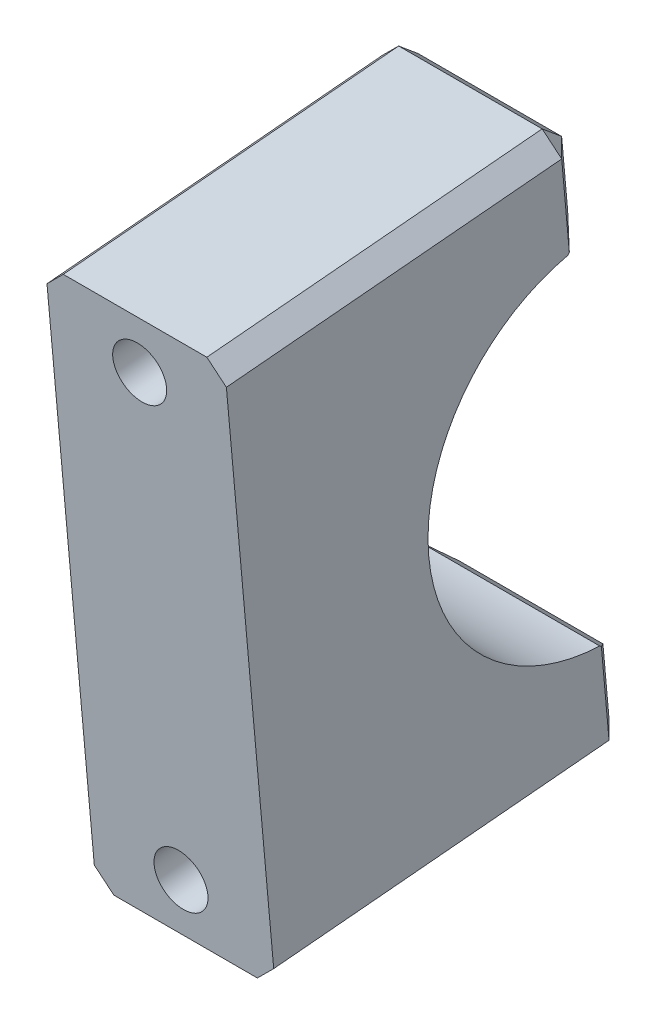
ISO-10303-21;
HEADER;
FILE_DESCRIPTION(('STEP AP214'),'2;1');
FILE_NAME('part.step','',(''),(''),'','','');
FILE_SCHEMA(('AUTOMOTIVE_DESIGN { 1 0 10303 214 1 1 1 1 }'));
ENDSEC;
DATA;
#1=APPLICATION_CONTEXT('core data for automotive mechanical design processes');
#2=APPLICATION_PROTOCOL_DEFINITION('international standard','automotive_design',2000,#1);
#3=PRODUCT_CONTEXT('',#1,'mechanical');
#4=PRODUCT('Part','Part','',(#3));
#5=PRODUCT_RELATED_PRODUCT_CATEGORY('part','',(#4));
#6=PRODUCT_DEFINITION_FORMATION('','',#4);
#7=PRODUCT_DEFINITION_CONTEXT('part definition',#1,'design');
#8=PRODUCT_DEFINITION('design','',#6,#7);
#9=PRODUCT_DEFINITION_SHAPE('','',#8);
#10=(LENGTH_UNIT() NAMED_UNIT(*) SI_UNIT(.MILLI.,.METRE.));
#11=(NAMED_UNIT(*) PLANE_ANGLE_UNIT() SI_UNIT($,.RADIAN.));
#12=(NAMED_UNIT(*) SI_UNIT($,.STERADIAN.) SOLID_ANGLE_UNIT());
#13=UNCERTAINTY_MEASURE_WITH_UNIT(LENGTH_MEASURE(1.E-05),#10,'distance_accuracy_value','');
#14=(GEOMETRIC_REPRESENTATION_CONTEXT(3) GLOBAL_UNCERTAINTY_ASSIGNED_CONTEXT((#13)) GLOBAL_UNIT_ASSIGNED_CONTEXT((#10,
#11,#12)) REPRESENTATION_CONTEXT('',''));
#15=CARTESIAN_POINT('',(0.,0.,0.));
#16=DIRECTION('',(0.,0.,1.));
#17=DIRECTION('',(1.,0.,0.));
#18=AXIS2_PLACEMENT_3D('',#15,#16,#17);
#19=CARTESIAN_POINT('',(0.,12.6267527219774,-140.67598203209));
#20=DIRECTION('',(0.,0.0893983070615616,-0.995995955159722));
#21=DIRECTION('',(0.,0.995995955159722,0.0893983070615616));
#22=AXIS2_PLACEMENT_3D('',#19,#20,#21);
#23=PLANE('',#22);
#24=DIRECTION('',(0.,-0.995995955159722,-0.0893983070615616));
#25=VECTOR('',#24,1.);
#26=CARTESIAN_POINT('',(-143.608320490601,136.633762355327,-129.545397949336));
#27=LINE('',#26,#25);
#28=CARTESIAN_POINT('',(-143.608320490601,141.367496523087,-129.120508853668));
#29=VERTEX_POINT('',#28);
#30=CARTESIAN_POINT('',(-143.608320490601,137.629758310487,-129.455999642275));
#31=VERTEX_POINT('',#30);
#32=EDGE_CURVE('E240',#29,#31,#27,.T.);
#33=ORIENTED_EDGE('',*,*,#32,.T.);
#34=DIRECTION('',(-1.,0.,0.));
#35=VECTOR('',#34,1.);
#36=CARTESIAN_POINT('',(-152.608320490601,137.629758310487,-129.455999642275));
#37=LINE('',#36,#35);
#38=CARTESIAN_POINT('',(-151.608320490601,137.629758310487,-129.455999642275));
#39=VERTEX_POINT('',#38);
#40=EDGE_CURVE('E251',#31,#39,#37,.T.);
#41=ORIENTED_EDGE('',*,*,#40,.T.);
#42=DIRECTION('',(0.,0.995995955159722,0.0893983070615616));
#43=VECTOR('',#42,1.);
#44=CARTESIAN_POINT('',(-151.608320490601,142.363492478246,-129.031110546606));
#45=LINE('',#44,#43);
#46=CARTESIAN_POINT('',(-151.608320490601,141.367496523087,-129.120508853668));
#47=VERTEX_POINT('',#46);
#48=EDGE_CURVE('E249',#39,#47,#45,.T.);
#49=ORIENTED_EDGE('',*,*,#48,.T.);
#50=DIRECTION('',(1.,0.,0.));
#51=VECTOR('',#50,1.);
#52=CARTESIAN_POINT('',(-142.608320490601,141.367496523087,-129.120508853668));
#53=LINE('',#52,#51);
#54=EDGE_CURVE('E247',#47,#29,#53,.T.);
#55=ORIENTED_EDGE('',*,*,#54,.T.);
#56=EDGE_LOOP('',(#33,#41,#49,#55));
#57=FACE_BOUND('',#56,.T.);
#58=CARTESIAN_POINT('',(-147.608320490601,139.500004107162,-129.288130679408));
#59=DIRECTION('',(0.,0.0893983070615618,-0.995995955159722));
#60=DIRECTION('',(0.,0.995995955159722,0.0893983070615618));
#61=AXIS2_PLACEMENT_3D('',#58,#59,#60);
#62=CIRCLE('',#61,1.5);
#63=CARTESIAN_POINT('',(-147.608320490601,138.006010174423,-129.42222814));
#64=VERTEX_POINT('',#63);
#65=EDGE_CURVE('E311',#64,#64,#62,.T.);
#66=ORIENTED_EDGE('',*,*,#65,.F.);
#67=EDGE_LOOP('',(#66));
#68=FACE_BOUND('',#67,.T.);
#69=ADVANCED_FACE('F36',(#57,#68),#23,.T.);
#70=DIRECTION('',(0.,0.995995955159722,0.0893983070615616));
#71=VECTOR('',#70,1.);
#72=CARTESIAN_POINT('',(-151.608320490601,116.719350013635,-131.332869816315));
#73=LINE('',#72,#71);
#74=CARTESIAN_POINT('',(-151.608320490601,111.985615845875,-131.757758911984));
#75=VERTEX_POINT('',#74);
#76=CARTESIAN_POINT('',(-151.608320490601,115.723354058475,-131.422268123377));
#77=VERTEX_POINT('',#76);
#78=EDGE_CURVE('E270',#75,#77,#73,.T.);
#79=ORIENTED_EDGE('',*,*,#78,.T.);
#80=DIRECTION('',(1.,0.,0.));
#81=VECTOR('',#80,1.);
#82=CARTESIAN_POINT('',(-142.608320490601,115.723354058475,-131.422268123377));
#83=LINE('',#82,#81);
#84=CARTESIAN_POINT('',(-143.608320490601,115.723354058475,-131.422268123377));
#85=VERTEX_POINT('',#84);
#86=EDGE_CURVE('E272',#77,#85,#83,.T.);
#87=ORIENTED_EDGE('',*,*,#86,.T.);
#88=DIRECTION('',(0.,-0.995995955159722,-0.0893983070615616));
#89=VECTOR('',#88,1.);
#90=CARTESIAN_POINT('',(-143.608320490601,110.989619890715,-131.847157219045));
#91=LINE('',#90,#89);
#92=CARTESIAN_POINT('',(-143.608320490601,111.985615845875,-131.757758911984));
#93=VERTEX_POINT('',#92);
#94=EDGE_CURVE('E233',#85,#93,#91,.T.);
#95=ORIENTED_EDGE('',*,*,#94,.T.);
#96=DIRECTION('',(-1.,0.,0.));
#97=VECTOR('',#96,1.);
#98=CARTESIAN_POINT('',(-152.608320490601,111.985615845875,-131.757758911984));
#99=LINE('',#98,#97);
#100=EDGE_CURVE('E267',#93,#75,#99,.T.);
#101=ORIENTED_EDGE('',*,*,#100,.T.);
#102=EDGE_LOOP('',(#79,#87,#95,#101));
#103=FACE_BOUND('',#102,.T.);
#104=CARTESIAN_POINT('',(-147.608320490601,113.853108261799,-131.590137086243));
#105=DIRECTION('',(0.,0.0893983070615618,-0.995995955159722));
#106=DIRECTION('',(0.,-0.995995955159722,-0.0893983070615618));
#107=AXIS2_PLACEMENT_3D('',#104,#105,#106);
#108=CIRCLE('',#107,1.5);
#109=CARTESIAN_POINT('',(-147.608320490601,112.35911432906,-131.724234546836));
#110=VERTEX_POINT('',#109);
#111=EDGE_CURVE('E308',#110,#110,#108,.T.);
#112=ORIENTED_EDGE('',*,*,#111,.F.);
#113=EDGE_LOOP('',(#112));
#114=FACE_BOUND('',#113,.T.);
#115=ADVANCED_FACE('F289',(#103,#114),#23,.T.);
#116=CARTESIAN_POINT('',(-142.608320490601,110.989619890715,-131.847157219045));
#117=DIRECTION('',(-1.,0.,0.));
#118=DIRECTION('',(0.,0.,1.));
#119=AXIS2_PLACEMENT_3D('',#116,#117,#118);
#120=PLANE('',#119);
#121=DIRECTION('',(0.,-0.0893983070615619,0.995995955159722));
#122=VECTOR('',#121,1.);
#123=CARTESIAN_POINT('',(-142.608320490601,141.367496523087,-129.120508853668));
#124=LINE('',#123,#122);
#125=CARTESIAN_POINT('',(-142.608320490601,141.278098216025,-128.124512898508));
#126=VERTEX_POINT('',#125);
#127=CARTESIAN_POINT('',(-142.608320490601,139.600549700035,-109.434768188248));
#128=VERTEX_POINT('',#127);
#129=EDGE_CURVE('E320',#126,#128,#124,.T.);
#130=ORIENTED_EDGE('',*,*,#129,.T.);
#131=DIRECTION('',(0.,0.995995955159722,0.0893983070615619));
#132=VECTOR('',#131,1.);
#133=CARTESIAN_POINT('',(-142.608320490601,110.218669022824,-112.072018246564));
#134=LINE('',#133,#132);
#135=CARTESIAN_POINT('',(-142.608320490601,110.218669022824,-112.072018246564));
#136=VERTEX_POINT('',#135);
#137=EDGE_CURVE('E166',#136,#128,#134,.T.);
#138=ORIENTED_EDGE('',*,*,#137,.F.);
#139=DIRECTION('',(0.,0.0893983070615619,-0.995995955159722));
#140=VECTOR('',#139,1.);
#141=CARTESIAN_POINT('',(-142.608320490601,111.985615845875,-131.757758911984));
#142=LINE('',#141,#140);
#143=CARTESIAN_POINT('',(-142.608320490601,111.896217538813,-130.761762956824));
#144=VERTEX_POINT('',#143);
#145=EDGE_CURVE('E165',#136,#144,#142,.T.);
#146=ORIENTED_EDGE('',*,*,#145,.T.);
#147=DIRECTION('',(0.,0.995995955159722,0.0893983070615616));
#148=VECTOR('',#147,1.);
#149=CARTESIAN_POINT('',(-142.608320490601,116.629951706573,-130.336873861156));
#150=LINE('',#149,#148);
#151=CARTESIAN_POINT('',(-142.608320490601,116.629951706573,-130.336873861156));
#152=VERTEX_POINT('',#151);
#153=EDGE_CURVE('E235',#144,#152,#150,.T.);
#154=ORIENTED_EDGE('',*,*,#153,.T.);
#155=DIRECTION('',(0.,0.641061344777993,0.767489643077632));
#156=VECTOR('',#155,1.);
#157=CARTESIAN_POINT('',(-142.608320490601,116.706755589676,-130.244922934291));
#158=LINE('',#157,#156);
#159=CARTESIAN_POINT('',(-142.608320490601,116.706755589676,-130.244922934291));
#160=VERTEX_POINT('',#159);
#161=EDGE_CURVE('E238',#152,#160,#158,.T.);
#162=ORIENTED_EDGE('',*,*,#161,.T.);
#163=CARTESIAN_POINT('',(-142.608320490601,126.697575502661,-130.673312320601));
#164=DIRECTION('',(-1.,0.,0.));
#165=DIRECTION('',(0.,0.,1.));
#166=AXIS2_PLACEMENT_3D('',#163,#164,#165);
#167=CIRCLE('',#166,9.99999999999998);
#168=CARTESIAN_POINT('',(-142.608320490601,136.452413121401,-128.472598111074));
#169=VERTEX_POINT('',#168);
#170=EDGE_CURVE('E300',#160,#169,#167,.T.);
#171=ORIENTED_EDGE('',*,*,#170,.T.);
#172=DIRECTION('',(0.,-0.767489643077631,0.641061344777995));
#173=VECTOR('',#172,1.);
#174=CARTESIAN_POINT('',(-142.608320490601,136.452413121401,-128.472598111074));
#175=LINE('',#174,#173);
#176=CARTESIAN_POINT('',(-142.608320490601,136.544364048265,-128.549401994176));
#177=VERTEX_POINT('',#176);
#178=EDGE_CURVE('E242',#169,#177,#175,.F.);
#179=ORIENTED_EDGE('',*,*,#178,.T.);
#180=DIRECTION('',(0.,0.995995955159722,0.0893983070615616));
#181=VECTOR('',#180,1.);
#182=CARTESIAN_POINT('',(-142.608320490601,142.274094171185,-128.035114591446));
#183=LINE('',#182,#181);
#184=EDGE_CURVE('E322',#177,#126,#183,.T.);
#185=ORIENTED_EDGE('',*,*,#184,.T.);
#186=EDGE_LOOP('',(#130,#138,#146,#154,#162,#171,#179,#185));
#187=FACE_BOUND('',#186,.T.);
#188=ADVANCED_FACE('F299',(#187),#120,.F.);
#189=CARTESIAN_POINT('',(-152.608320490601,110.989619890715,-131.847157219045));
#190=DIRECTION('',(0.,0.995995955159722,0.0893983070615618));
#191=DIRECTION('',(0.,-0.0893983070615619,0.995995955159722));
#192=AXIS2_PLACEMENT_3D('',#189,#190,#191);
#193=PLANE('',#192);
#194=DIRECTION('',(0.,-0.0893983070615619,0.995995955159722));
#195=VECTOR('',#194,1.);
#196=CARTESIAN_POINT('',(-143.608320490601,110.989619890715,-131.847157219045));
#197=LINE('',#196,#195);
#198=CARTESIAN_POINT('',(-143.608320490601,110.900221583654,-130.851161263886));
#199=VERTEX_POINT('',#198);
#200=CARTESIAN_POINT('',(-143.608320490601,109.222673067664,-112.161416553626));
#201=VERTEX_POINT('',#200);
#202=EDGE_CURVE('E163',#199,#201,#197,.T.);
#203=ORIENTED_EDGE('',*,*,#202,.T.);
#204=DIRECTION('',(1.,0.,0.));
#205=VECTOR('',#204,1.);
#206=CARTESIAN_POINT('',(-151.608320490601,109.222673067664,-112.161416553626));
#207=LINE('',#206,#205);
#208=CARTESIAN_POINT('',(-151.608320490601,109.222673067664,-112.161416553626));
#209=VERTEX_POINT('',#208);
#210=EDGE_CURVE('E149',#209,#201,#207,.T.);
#211=ORIENTED_EDGE('',*,*,#210,.F.);
#212=DIRECTION('',(0.,0.0893983070615619,-0.995995955159722));
#213=VECTOR('',#212,1.);
#214=CARTESIAN_POINT('',(-151.608320490601,110.989619890715,-131.847157219045));
#215=LINE('',#214,#213);
#216=CARTESIAN_POINT('',(-151.608320490601,110.900221583654,-130.851161263886));
#217=VERTEX_POINT('',#216);
#218=EDGE_CURVE('E174',#209,#217,#215,.T.);
#219=ORIENTED_EDGE('',*,*,#218,.T.);
#220=DIRECTION('',(1.,0.,0.));
#221=VECTOR('',#220,1.);
#222=CARTESIAN_POINT('',(-142.608320490601,110.900221583654,-130.851161263886));
#223=LINE('',#222,#221);
#224=EDGE_CURVE('E170',#217,#199,#223,.T.);
#225=ORIENTED_EDGE('',*,*,#224,.T.);
#226=EDGE_LOOP('',(#203,#211,#219,#225));
#227=FACE_BOUND('',#226,.T.);
#228=ADVANCED_FACE('F168',(#227),#193,.F.);
#229=CARTESIAN_POINT('',(-152.608320490601,110.989619890715,-131.847157219045));
#230=DIRECTION('',(1.,0.,0.));
#231=DIRECTION('',(0.,0.,-1.));
#232=AXIS2_PLACEMENT_3D('',#229,#230,#231);
#233=PLANE('',#232);
#234=DIRECTION('',(0.,-0.0893983070615619,0.995995955159722));
#235=VECTOR('',#234,1.);
#236=CARTESIAN_POINT('',(-152.608320490601,111.985615845875,-131.757758911984));
#237=LINE('',#236,#235);
#238=CARTESIAN_POINT('',(-152.608320490601,111.896217538813,-130.761762956824));
#239=VERTEX_POINT('',#238);
#240=CARTESIAN_POINT('',(-152.608320490601,110.218669022824,-112.072018246564));
#241=VERTEX_POINT('',#240);
#242=EDGE_CURVE('E260',#239,#241,#237,.T.);
#243=ORIENTED_EDGE('',*,*,#242,.T.);
#244=DIRECTION('',(0.,-0.995995955159722,-0.0893983070615619));
#245=VECTOR('',#244,1.);
#246=CARTESIAN_POINT('',(-152.608320490601,139.600549700035,-109.434768188248));
#247=LINE('',#246,#245);
#248=CARTESIAN_POINT('',(-152.608320490601,139.600549700035,-109.434768188248));
#249=VERTEX_POINT('',#248);
#250=EDGE_CURVE('E54',#249,#241,#247,.T.);
#251=ORIENTED_EDGE('',*,*,#250,.F.);
#252=DIRECTION('',(0.,0.0893983070615619,-0.995995955159722));
#253=VECTOR('',#252,1.);
#254=CARTESIAN_POINT('',(-152.608320490601,141.367496523087,-129.120508853668));
#255=LINE('',#254,#253);
#256=CARTESIAN_POINT('',(-152.608320490601,141.278098216025,-128.124512898508));
#257=VERTEX_POINT('',#256);
#258=EDGE_CURVE('E254',#249,#257,#255,.T.);
#259=ORIENTED_EDGE('',*,*,#258,.T.);
#260=DIRECTION('',(0.,-0.995995955159722,-0.0893983070615616));
#261=VECTOR('',#260,1.);
#262=CARTESIAN_POINT('',(-152.608320490601,136.544364048265,-128.549401994176));
#263=LINE('',#262,#261);
#264=CARTESIAN_POINT('',(-152.608320490601,136.544364048265,-128.549401994176));
#265=VERTEX_POINT('',#264);
#266=EDGE_CURVE('E256',#257,#265,#263,.T.);
#267=ORIENTED_EDGE('',*,*,#266,.T.);
#268=DIRECTION('',(0.,0.767489643077631,-0.641061344777995));
#269=VECTOR('',#268,1.);
#270=CARTESIAN_POINT('',(-152.608320490601,136.452413121401,-128.472598111074));
#271=LINE('',#270,#269);
#272=CARTESIAN_POINT('',(-152.608320490601,136.452413121401,-128.472598111074));
#273=VERTEX_POINT('',#272);
#274=EDGE_CURVE('E258',#265,#273,#271,.F.);
#275=ORIENTED_EDGE('',*,*,#274,.T.);
#276=CARTESIAN_POINT('',(-152.608320490601,126.697575502661,-130.673312320601));
#277=DIRECTION('',(1.,0.,0.));
#278=DIRECTION('',(0.,0.,-1.));
#279=AXIS2_PLACEMENT_3D('',#276,#277,#278);
#280=CIRCLE('',#279,9.99999999999998);
#281=CARTESIAN_POINT('',(-152.608320490601,116.706755589676,-130.244922934291));
#282=VERTEX_POINT('',#281);
#283=EDGE_CURVE('E202',#273,#282,#280,.T.);
#284=ORIENTED_EDGE('',*,*,#283,.T.);
#285=DIRECTION('',(0.,-0.641061344777993,-0.767489643077632));
#286=VECTOR('',#285,1.);
#287=CARTESIAN_POINT('',(-152.608320490601,116.706755589676,-130.244922934291));
#288=LINE('',#287,#286);
#289=CARTESIAN_POINT('',(-152.608320490601,116.629951706573,-130.336873861156));
#290=VERTEX_POINT('',#289);
#291=EDGE_CURVE('E265',#282,#290,#288,.T.);
#292=ORIENTED_EDGE('',*,*,#291,.T.);
#293=DIRECTION('',(0.,-0.995995955159722,-0.0893983070615616));
#294=VECTOR('',#293,1.);
#295=CARTESIAN_POINT('',(-152.608320490601,110.900221583654,-130.851161263886));
#296=LINE('',#295,#294);
#297=EDGE_CURVE('E263',#290,#239,#296,.T.);
#298=ORIENTED_EDGE('',*,*,#297,.T.);
#299=EDGE_LOOP('',(#243,#251,#259,#267,#275,#284,#292,#298));
#300=FACE_BOUND('',#299,.T.);
#301=ADVANCED_FACE('F379',(#300),#233,.F.);
#302=CARTESIAN_POINT('',(-152.608320490601,142.363492478246,-129.031110546606));
#303=DIRECTION('',(0.,-0.995995955159722,-0.0893983070615618));
#304=DIRECTION('',(0.,0.0893983070615619,-0.995995955159722));
#305=AXIS2_PLACEMENT_3D('',#302,#303,#304);
#306=PLANE('',#305);
#307=DIRECTION('',(0.,-0.0893983070615619,0.995995955159722));
#308=VECTOR('',#307,1.);
#309=CARTESIAN_POINT('',(-151.608320490601,142.363492478246,-129.031110546606));
#310=LINE('',#309,#308);
#311=CARTESIAN_POINT('',(-151.608320490601,142.274094171185,-128.035114591446));
#312=VERTEX_POINT('',#311);
#313=CARTESIAN_POINT('',(-151.608320490601,140.596545655195,-109.345369881187));
#314=VERTEX_POINT('',#313);
#315=EDGE_CURVE('E11',#312,#314,#310,.T.);
#316=ORIENTED_EDGE('',*,*,#315,.T.);
#317=DIRECTION('',(-1.,0.,0.));
#318=VECTOR('',#317,1.);
#319=CARTESIAN_POINT('',(-143.608320490601,140.596545655195,-109.345369881187));
#320=LINE('',#319,#318);
#321=CARTESIAN_POINT('',(-143.608320490601,140.596545655195,-109.345369881187));
#322=VERTEX_POINT('',#321);
#323=EDGE_CURVE('E352',#322,#314,#320,.T.);
#324=ORIENTED_EDGE('',*,*,#323,.F.);
#325=DIRECTION('',(0.,0.0893983070615619,-0.995995955159722));
#326=VECTOR('',#325,1.);
#327=CARTESIAN_POINT('',(-143.608320490601,142.363492478246,-129.031110546606));
#328=LINE('',#327,#326);
#329=CARTESIAN_POINT('',(-143.608320490601,142.274094171185,-128.035114591446));
#330=VERTEX_POINT('',#329);
#331=EDGE_CURVE('E171',#322,#330,#328,.T.);
#332=ORIENTED_EDGE('',*,*,#331,.T.);
#333=DIRECTION('',(-1.,0.,0.));
#334=VECTOR('',#333,1.);
#335=CARTESIAN_POINT('',(-152.608320490601,142.274094171185,-128.035114591446));
#336=LINE('',#335,#334);
#337=EDGE_CURVE('E46',#330,#312,#336,.T.);
#338=ORIENTED_EDGE('',*,*,#337,.T.);
#339=EDGE_LOOP('',(#316,#324,#332,#338));
#340=FACE_BOUND('',#339,.T.);
#341=ADVANCED_FACE('F367',(#340),#306,.F.);
#342=CARTESIAN_POINT('',(-147.608320490601,139.500004107162,-129.288130679408));
#343=DIRECTION('',(0.,-0.0893983070615618,0.995995955159722));
#344=DIRECTION('',(0.,-0.995995955159722,-0.0893983070615619));
#345=AXIS2_PLACEMENT_3D('',#342,#343,#344);
#346=CYLINDRICAL_SURFACE('',#345,1.5);
#347=CARTESIAN_POINT('',(-147.608320490601,137.733057284111,-109.602390013989));
#348=DIRECTION('',(0.,0.0893983070615619,-0.995995955159722));
#349=DIRECTION('',(0.,0.995995955159722,0.0893983070615619));
#350=AXIS2_PLACEMENT_3D('',#347,#348,#349);
#351=CIRCLE('',#350,1.5);
#352=CARTESIAN_POINT('',(-147.608320490601,136.239063351371,-109.736487474581));
#353=VERTEX_POINT('',#352);
#354=EDGE_CURVE('E207',#353,#353,#351,.T.);
#355=CARTESIAN_POINT('',(-147.608320490601,136.239063351371,-109.736487474581));
#356=CARTESIAN_POINT('',(-147.608320490601,136.257469047445,-109.941547273179));
#357=CARTESIAN_POINT('',(-147.608320490601,136.275874743518,-110.146607071777));
#358=CARTESIAN_POINT('',(-147.608320490601,136.312686135665,-110.556726668973));
#359=CARTESIAN_POINT('',(-147.608320490601,136.331091831739,-110.761786467571));
#360=CARTESIAN_POINT('',(-147.608320490601,136.367903223886,-111.171906064768));
#361=CARTESIAN_POINT('',(-147.608320490601,136.386308919959,-111.376965863366));
#362=CARTESIAN_POINT('',(-147.608320490601,136.423120312106,-111.787085460562));
#363=CARTESIAN_POINT('',(-147.608320490601,136.441526008179,-111.99214525916));
#364=CARTESIAN_POINT('',(-147.608320490601,136.478337400326,-112.402264856356));
#365=CARTESIAN_POINT('',(-147.608320490601,136.4967430964,-112.607324654955));
#366=CARTESIAN_POINT('',(-147.608320490601,136.533554488547,-113.017444252151));
#367=CARTESIAN_POINT('',(-147.608320490601,136.55196018462,-113.222504050749));
#368=CARTESIAN_POINT('',(-147.608320490601,136.588771576767,-113.632623647945));
#369=CARTESIAN_POINT('',(-147.608320490601,136.60717727284,-113.837683446543));
#370=CARTESIAN_POINT('',(-147.608320490601,136.643988664987,-114.24780304374));
#371=CARTESIAN_POINT('',(-147.608320490601,136.662394361061,-114.452862842338));
#372=CARTESIAN_POINT('',(-147.608320490601,136.699205753208,-114.862982439534));
#373=CARTESIAN_POINT('',(-147.608320490601,136.717611449281,-115.068042238132));
#374=CARTESIAN_POINT('',(-147.608320490601,136.754422841428,-115.478161835328));
#375=CARTESIAN_POINT('',(-147.608320490601,136.772828537501,-115.683221633926));
#376=CARTESIAN_POINT('',(-147.608320490601,136.809639929648,-116.093341231123));
#377=CARTESIAN_POINT('',(-147.608320490601,136.828045625722,-116.298401029721));
#378=CARTESIAN_POINT('',(-147.608320490601,136.864857017869,-116.708520626917));
#379=CARTESIAN_POINT('',(-147.608320490601,136.883262713942,-116.913580425515));
#380=CARTESIAN_POINT('',(-147.608320490601,136.920074106089,-117.323700022711));
#381=CARTESIAN_POINT('',(-147.608320490601,136.938479802163,-117.528759821309));
#382=CARTESIAN_POINT('',(-147.608320490601,136.975291194309,-117.938879418506));
#383=CARTESIAN_POINT('',(-147.608320490601,136.993696890383,-118.143939217104));
#384=CARTESIAN_POINT('',(-147.608320490601,137.03050828253,-118.5540588143));
#385=CARTESIAN_POINT('',(-147.608320490601,137.048913978603,-118.759118612898));
#386=CARTESIAN_POINT('',(-147.608320490601,137.08572537075,-119.169238210094));
#387=CARTESIAN_POINT('',(-147.608320490601,137.104131066824,-119.374298008693));
#388=CARTESIAN_POINT('',(-147.608320490601,137.14094245897,-119.784417605889));
#389=CARTESIAN_POINT('',(-147.608320490601,137.159348155044,-119.989477404487));
#390=CARTESIAN_POINT('',(-147.608320490601,137.196159547191,-120.399597001683));
#391=CARTESIAN_POINT('',(-147.608320490601,137.214565243264,-120.604656800281));
#392=CARTESIAN_POINT('',(-147.608320490601,137.251376635411,-121.014776397478));
#393=CARTESIAN_POINT('',(-147.608320490601,137.269782331485,-121.219836196076));
#394=CARTESIAN_POINT('',(-147.608320490601,137.306593723632,-121.629955793272));
#395=CARTESIAN_POINT('',(-147.608320490601,137.324999419705,-121.83501559187));
#396=CARTESIAN_POINT('',(-147.608320490601,137.361810811852,-122.245135189066));
#397=CARTESIAN_POINT('',(-147.608320490601,137.380216507925,-122.450194987664));
#398=CARTESIAN_POINT('',(-147.608320490601,137.417027900072,-122.860314584861));
#399=CARTESIAN_POINT('',(-147.608320490601,137.435433596146,-123.065374383459));
#400=CARTESIAN_POINT('',(-147.608320490601,137.472244988293,-123.475493980655));
#401=CARTESIAN_POINT('',(-147.608320490601,137.490650684366,-123.680553779253));
#402=CARTESIAN_POINT('',(-147.608320490601,137.527462076513,-124.090673376449));
#403=CARTESIAN_POINT('',(-147.608320490601,137.545867772586,-124.295733175047));
#404=CARTESIAN_POINT('',(-147.608320490601,137.582679164733,-124.705852772244));
#405=CARTESIAN_POINT('',(-147.608320490601,137.601084860807,-124.910912570842));
#406=CARTESIAN_POINT('',(-147.608320490601,137.637896252954,-125.321032168038));
#407=CARTESIAN_POINT('',(-147.608320490601,137.656301949027,-125.526091966636));
#408=CARTESIAN_POINT('',(-147.608320490601,137.693113341174,-125.936211563832));
#409=CARTESIAN_POINT('',(-147.608320490601,137.711519037247,-126.141271362431));
#410=CARTESIAN_POINT('',(-147.608320490601,137.748330429394,-126.551390959627));
#411=CARTESIAN_POINT('',(-147.608320490601,137.766736125468,-126.756450758225));
#412=CARTESIAN_POINT('',(-147.608320490601,137.803547517615,-127.166570355421));
#413=CARTESIAN_POINT('',(-147.608320490601,137.821953213688,-127.371630154019));
#414=CARTESIAN_POINT('',(-147.608320490601,137.858764605835,-127.781749751216));
#415=CARTESIAN_POINT('',(-147.608320490601,137.877170301909,-127.986809549814));
#416=CARTESIAN_POINT('',(-147.608320490601,137.913981694055,-128.39692914701));
#417=CARTESIAN_POINT('',(-147.608320490601,137.932387390129,-128.601988945608));
#418=CARTESIAN_POINT('',(-147.608320490601,137.969198782276,-129.012108542804));
#419=CARTESIAN_POINT('',(-147.608320490601,137.987604478349,-129.217168341402));
#420=CARTESIAN_POINT('',(-147.608320490601,138.006010174423,-129.42222814));
#421=B_SPLINE_CURVE_WITH_KNOTS('',3,(#355,#356,#357,#358,#359,#360,#361,#362,#363,#364,#365,
#366,#367,#368,#369,#370,#371,#372,#373,#374,#375,#376,#377,#378,#379,#380,#381,#382,#383,#384,
#385,#386,#387,#388,#389,#390,#391,#392,#393,#394,#395,#396,#397,#398,#399,#400,#401,#402,#403,
#404,#405,#406,#407,#408,#409,#410,#411,#412,#413,#414,#415,#416,#417,#418,#419,#420),
.UNSPECIFIED.,.F.,.F.,(4,2,2,2,2,2,2,2,2,2,2,2,2,2,2,2,2,2,2,2,2,2,2,2,2,2,2,2,2,2,2,2,4),(0.,
0.617652504116555,1.23530500823311,1.85295751234967,2.47061001646622,3.08826252058278,
3.70591502469933,4.32356752881589,4.94122003293245,5.558872537049,6.17652504116556,
6.79417754528211,7.41183004939867,8.02948255351522,8.64713505763178,9.26478756174834,
9.88244006586489,10.5000925699814,11.117745074098,11.7353975782146,12.3530500823311,
12.9707025864477,13.5883550905642,14.2060075946808,14.8236600987973,15.4413126029139,
16.0589651070305,16.676617611147,17.2942701152636,17.9119226193801,18.5295751234967,
19.1472276276132,19.7648801317298),.UNSPECIFIED.);
#422=EDGE_CURVE('BSEAM363',#353,#64,#421,.T.);
#423=ORIENTED_EDGE('',*,*,#354,.F.);
#424=ORIENTED_EDGE('',*,*,#65,.T.);
#425=ORIENTED_EDGE('',*,*,#422,.T.);
#426=ORIENTED_EDGE('',*,*,#422,.F.);
#427=EDGE_LOOP('',(#423,#425,#424,#426));
#428=FACE_BOUND('',#427,.T.);
#429=ADVANCED_FACE('F363',(#428),#346,.F.);
#430=CARTESIAN_POINT('',(-147.608320490601,113.853108261799,-131.590137086243));
#431=DIRECTION('',(0.,-0.0893983070615618,0.995995955159722));
#432=DIRECTION('',(0.,-0.995995955159722,-0.0893983070615619));
#433=AXIS2_PLACEMENT_3D('',#430,#431,#432);
#434=CYLINDRICAL_SURFACE('',#433,1.5);
#435=CARTESIAN_POINT('',(-147.608320490601,112.086161438748,-111.904396420824));
#436=DIRECTION('',(0.,0.0893983070615619,-0.995995955159722));
#437=DIRECTION('',(0.,0.995995955159722,0.0893983070615619));
#438=AXIS2_PLACEMENT_3D('',#435,#436,#437);
#439=CIRCLE('',#438,1.5);
#440=CARTESIAN_POINT('',(-147.608320490601,110.592167506009,-112.038493881416));
#441=VERTEX_POINT('',#440);
#442=EDGE_CURVE('E356',#441,#441,#439,.T.);
#443=CARTESIAN_POINT('',(-147.608320490601,110.592167506009,-112.038493881416));
#444=CARTESIAN_POINT('',(-147.608320490601,110.610573202082,-112.243553680014));
#445=CARTESIAN_POINT('',(-147.608320490601,110.628978898155,-112.448613478612));
#446=CARTESIAN_POINT('',(-147.608320490601,110.665790290302,-112.858733075809));
#447=CARTESIAN_POINT('',(-147.608320490601,110.684195986376,-113.063792874407));
#448=CARTESIAN_POINT('',(-147.608320490601,110.721007378523,-113.473912471603));
#449=CARTESIAN_POINT('',(-147.608320490601,110.739413074596,-113.678972270201));
#450=CARTESIAN_POINT('',(-147.608320490601,110.776224466743,-114.089091867397));
#451=CARTESIAN_POINT('',(-147.608320490601,110.794630162817,-114.294151665995));
#452=CARTESIAN_POINT('',(-147.608320490601,110.831441554963,-114.704271263192));
#453=CARTESIAN_POINT('',(-147.608320490601,110.849847251037,-114.90933106179));
#454=CARTESIAN_POINT('',(-147.608320490601,110.886658643184,-115.319450658986));
#455=CARTESIAN_POINT('',(-147.608320490601,110.905064339257,-115.524510457584));
#456=CARTESIAN_POINT('',(-147.608320490601,110.941875731404,-115.93463005478));
#457=CARTESIAN_POINT('',(-147.608320490601,110.960281427478,-116.139689853379));
#458=CARTESIAN_POINT('',(-147.608320490601,110.997092819624,-116.549809450575));
#459=CARTESIAN_POINT('',(-147.608320490601,111.015498515698,-116.754869249173));
#460=CARTESIAN_POINT('',(-147.608320490601,111.052309907845,-117.164988846369));
#461=CARTESIAN_POINT('',(-147.608320490601,111.070715603918,-117.370048644967));
#462=CARTESIAN_POINT('',(-147.608320490601,111.107526996065,-117.780168242163));
#463=CARTESIAN_POINT('',(-147.608320490601,111.125932692139,-117.985228040762));
#464=CARTESIAN_POINT('',(-147.608320490601,111.162744084286,-118.395347637958));
#465=CARTESIAN_POINT('',(-147.608320490601,111.181149780359,-118.600407436556));
#466=CARTESIAN_POINT('',(-147.608320490601,111.217961172506,-119.010527033752));
#467=CARTESIAN_POINT('',(-147.608320490601,111.236366868579,-119.21558683235));
#468=CARTESIAN_POINT('',(-147.608320490601,111.273178260726,-119.625706429547));
#469=CARTESIAN_POINT('',(-147.608320490601,111.2915839568,-119.830766228145));
#470=CARTESIAN_POINT('',(-147.608320490601,111.328395348947,-120.240885825341));
#471=CARTESIAN_POINT('',(-147.608320490601,111.34680104502,-120.445945623939));
#472=CARTESIAN_POINT('',(-147.608320490601,111.383612437167,-120.856065221135));
#473=CARTESIAN_POINT('',(-147.608320490601,111.40201813324,-121.061125019733));
#474=CARTESIAN_POINT('',(-147.608320490601,111.438829525387,-121.47124461693));
#475=CARTESIAN_POINT('',(-147.608320490601,111.457235221461,-121.676304415528));
#476=CARTESIAN_POINT('',(-147.608320490601,111.494046613608,-122.086424012724));
#477=CARTESIAN_POINT('',(-147.608320490601,111.512452309681,-122.291483811322));
#478=CARTESIAN_POINT('',(-147.608320490601,111.549263701828,-122.701603408518));
#479=CARTESIAN_POINT('',(-147.608320490601,111.567669397901,-122.906663207117));
#480=CARTESIAN_POINT('',(-147.608320490601,111.604480790048,-123.316782804313));
#481=CARTESIAN_POINT('',(-147.608320490601,111.622886486122,-123.521842602911));
#482=CARTESIAN_POINT('',(-147.608320490601,111.659697878269,-123.931962200107));
#483=CARTESIAN_POINT('',(-147.608320490601,111.678103574342,-124.137021998705));
#484=CARTESIAN_POINT('',(-147.608320490601,111.714914966489,-124.547141595901));
#485=CARTESIAN_POINT('',(-147.608320490601,111.733320662563,-124.7522013945));
#486=CARTESIAN_POINT('',(-147.608320490601,111.770132054709,-125.162320991696));
#487=CARTESIAN_POINT('',(-147.608320490601,111.788537750783,-125.367380790294));
#488=CARTESIAN_POINT('',(-147.608320490601,111.82534914293,-125.77750038749));
#489=CARTESIAN_POINT('',(-147.608320490601,111.843754839003,-125.982560186088));
#490=CARTESIAN_POINT('',(-147.608320490601,111.88056623115,-126.392679783285));
#491=CARTESIAN_POINT('',(-147.608320490601,111.898971927224,-126.597739581883));
#492=CARTESIAN_POINT('',(-147.608320490601,111.935783319371,-127.007859179079));
#493=CARTESIAN_POINT('',(-147.608320490601,111.954189015444,-127.212918977677));
#494=CARTESIAN_POINT('',(-147.608320490601,111.991000407591,-127.623038574873));
#495=CARTESIAN_POINT('',(-147.608320490601,112.009406103664,-127.828098373471));
#496=CARTESIAN_POINT('',(-147.608320490601,112.046217495811,-128.238217970668));
#497=CARTESIAN_POINT('',(-147.608320490601,112.064623191885,-128.443277769266));
#498=CARTESIAN_POINT('',(-147.608320490601,112.101434584032,-128.853397366462));
#499=CARTESIAN_POINT('',(-147.608320490601,112.119840280105,-129.05845716506));
#500=CARTESIAN_POINT('',(-147.608320490601,112.156651672252,-129.468576762256));
#501=CARTESIAN_POINT('',(-147.608320490601,112.175057368325,-129.673636560855));
#502=CARTESIAN_POINT('',(-147.608320490601,112.211868760472,-130.083756158051));
#503=CARTESIAN_POINT('',(-147.608320490601,112.230274456546,-130.288815956649));
#504=CARTESIAN_POINT('',(-147.608320490601,112.267085848693,-130.698935553845));
#505=CARTESIAN_POINT('',(-147.608320490601,112.285491544766,-130.903995352443));
#506=CARTESIAN_POINT('',(-147.608320490601,112.322302936913,-131.314114949639));
#507=CARTESIAN_POINT('',(-147.608320490601,112.340708632986,-131.519174748238));
#508=CARTESIAN_POINT('',(-147.608320490601,112.35911432906,-131.724234546836));
#509=B_SPLINE_CURVE_WITH_KNOTS('',3,(#443,#444,#445,#446,#447,#448,#449,#450,#451,#452,#453,
#454,#455,#456,#457,#458,#459,#460,#461,#462,#463,#464,#465,#466,#467,#468,#469,#470,#471,#472,
#473,#474,#475,#476,#477,#478,#479,#480,#481,#482,#483,#484,#485,#486,#487,#488,#489,#490,#491,
#492,#493,#494,#495,#496,#497,#498,#499,#500,#501,#502,#503,#504,#505,#506,#507,#508),
.UNSPECIFIED.,.F.,.F.,(4,2,2,2,2,2,2,2,2,2,2,2,2,2,2,2,2,2,2,2,2,2,2,2,2,2,2,2,2,2,2,2,4),(0.,
0.617652504116542,1.2353050082331,1.85295751234965,2.47061001646621,3.08826252058276,
3.70591502469932,4.32356752881588,4.94122003293243,5.55887253704899,6.17652504116554,
6.7941775452821,7.41183004939864,8.0294825535152,8.64713505763175,9.26478756174831,
9.88244006586486,10.5000925699814,11.117745074098,11.7353975782145,12.3530500823311,
12.9707025864476,13.5883550905642,14.2060075946808,14.8236600987973,15.4413126029139,
16.0589651070304,16.676617611147,17.2942701152635,17.9119226193801,18.5295751234966,
19.1472276276132,19.7648801317297),.UNSPECIFIED.);
#510=EDGE_CURVE('BSEAM366',#441,#110,#509,.T.);
#511=ORIENTED_EDGE('',*,*,#442,.F.);
#512=ORIENTED_EDGE('',*,*,#111,.T.);
#513=ORIENTED_EDGE('',*,*,#510,.T.);
#514=ORIENTED_EDGE('',*,*,#510,.F.);
#515=EDGE_LOOP('',(#511,#513,#512,#514));
#516=FACE_BOUND('',#515,.T.);
#517=ADVANCED_FACE('F366',(#516),#434,.F.);
#518=CARTESIAN_POINT('',(-152.608320490601,126.697575502661,-130.673312320601));
#519=DIRECTION('',(1.,0.,0.));
#520=DIRECTION('',(0.,0.,-1.));
#521=AXIS2_PLACEMENT_3D('',#518,#519,#520);
#522=CYLINDRICAL_SURFACE('',#521,9.99999999999998);
#523=ORIENTED_EDGE('',*,*,#283,.F.);
#524=DIRECTION('',(1.,0.,0.));
#525=VECTOR('',#524,1.);
#526=CARTESIAN_POINT('',(-152.608320490601,136.452413121401,-128.472598111074));
#527=LINE('',#526,#525);
#528=EDGE_CURVE('E307',#273,#169,#527,.T.);
#529=ORIENTED_EDGE('',*,*,#528,.T.);
#530=ORIENTED_EDGE('',*,*,#170,.F.);
#531=DIRECTION('',(1.,0.,0.));
#532=VECTOR('',#531,1.);
#533=CARTESIAN_POINT('',(-152.608320490601,116.706755589676,-130.244922934291));
#534=LINE('',#533,#532);
#535=EDGE_CURVE('E295',#160,#282,#534,.F.);
#536=ORIENTED_EDGE('',*,*,#535,.T.);
#537=EDGE_LOOP('',(#523,#529,#530,#536));
#538=FACE_BOUND('',#537,.T.);
#539=ADVANCED_FACE('F304',(#538),#522,.F.);
#540=CARTESIAN_POINT('',(-151.608320490601,142.363492478246,-129.031110546606));
#541=DIRECTION('',(0.707106781186549,-0.704275493927811,-0.0632141491498277));
#542=DIRECTION('',(0.,-0.0893983070615619,0.995995955159722));
#543=AXIS2_PLACEMENT_3D('',#540,#541,#542);
#544=PLANE('',#543);
#545=DIRECTION('',(-0.707106781186555,-0.704275493927804,-0.0632141491498269));
#546=VECTOR('',#545,1.);
#547=CARTESIAN_POINT('',(-151.608320490601,140.596545655195,-109.345369881187));
#548=LINE('',#547,#546);
#549=EDGE_CURVE('E634',#314,#249,#548,.T.);
#550=ORIENTED_EDGE('',*,*,#549,.F.);
#551=ORIENTED_EDGE('',*,*,#315,.F.);
#552=DIRECTION('',(-0.707106781186546,-0.704275493927813,-0.063214149149825));
#553=VECTOR('',#552,1.);
#554=CARTESIAN_POINT('',(-152.108320490601,141.776096193605,-128.079813744977));
#555=LINE('',#554,#553);
#556=EDGE_CURVE('E196',#257,#312,#555,.F.);
#557=ORIENTED_EDGE('',*,*,#556,.F.);
#558=ORIENTED_EDGE('',*,*,#258,.F.);
#559=EDGE_LOOP('',(#550,#551,#557,#558));
#560=FACE_BOUND('',#559,.T.);
#561=ADVANCED_FACE('F427',(#560),#544,.F.);
#562=CARTESIAN_POINT('',(-142.608320490601,141.367496523087,-129.120508853668));
#563=DIRECTION('',(-0.707106781186549,-0.704275493927811,-0.0632141491498274));
#564=DIRECTION('',(0.,-0.0893983070615619,0.995995955159722));
#565=AXIS2_PLACEMENT_3D('',#562,#563,#564);
#566=PLANE('',#565);
#567=DIRECTION('',(-0.707106781186565,0.704275493927794,0.0632141491498262));
#568=VECTOR('',#567,1.);
#569=CARTESIAN_POINT('',(-142.608320490601,139.600549700035,-109.434768188248));
#570=LINE('',#569,#568);
#571=EDGE_CURVE('E350',#128,#322,#570,.T.);
#572=ORIENTED_EDGE('',*,*,#571,.F.);
#573=ORIENTED_EDGE('',*,*,#129,.F.);
#574=DIRECTION('',(-0.707106781186546,0.704275493927813,0.0632141491498285));
#575=VECTOR('',#574,1.);
#576=CARTESIAN_POINT('',(-143.108320490601,141.776096193605,-128.079813744977));
#577=LINE('',#576,#575);
#578=EDGE_CURVE('E193',#330,#126,#577,.F.);
#579=ORIENTED_EDGE('',*,*,#578,.F.);
#580=ORIENTED_EDGE('',*,*,#331,.F.);
#581=EDGE_LOOP('',(#572,#573,#579,#580));
#582=FACE_BOUND('',#581,.T.);
#583=ADVANCED_FACE('F349',(#582),#566,.F.);
#584=CARTESIAN_POINT('',(0.,141.367496523087,-129.120508853668));
#585=DIRECTION('',(0.,0.767489643077648,-0.641061344777974));
#586=DIRECTION('',(-1.,0.,0.));
#587=AXIS2_PLACEMENT_3D('',#584,#585,#586);
#588=PLANE('',#587);
#589=DIRECTION('',(0.,-0.641061344777974,-0.767489643077648));
#590=VECTOR('',#589,1.);
#591=CARTESIAN_POINT('',(-151.608320490601,141.367496523087,-129.120508853668));
#592=LINE('',#591,#590);
#593=EDGE_CURVE('E199',#312,#47,#592,.T.);
#594=ORIENTED_EDGE('',*,*,#593,.F.);
#595=ORIENTED_EDGE('',*,*,#337,.F.);
#596=DIRECTION('',(0.,0.641061344777974,0.767489643077648));
#597=VECTOR('',#596,1.);
#598=CARTESIAN_POINT('',(-143.608320490601,141.367496523087,-129.120508853668));
#599=LINE('',#598,#597);
#600=EDGE_CURVE('E190',#29,#330,#599,.T.);
#601=ORIENTED_EDGE('',*,*,#600,.F.);
#602=ORIENTED_EDGE('',*,*,#54,.F.);
#603=EDGE_LOOP('',(#594,#595,#601,#602));
#604=FACE_BOUND('',#603,.T.);
#605=ADVANCED_FACE('F342',(#604),#588,.T.);
#606=CARTESIAN_POINT('',(-151.608320490601,141.367496523087,-129.120508853668));
#607=DIRECTION('',(-0.577350269189634,0.626652669470336,-0.523424396176142));
#608=DIRECTION('',(-0.735445572174874,-0.677583803206933,0.));
#609=AXIS2_PLACEMENT_3D('',#606,#607,#608);
#610=PLANE('',#609);
#611=ORIENTED_EDGE('',*,*,#556,.T.);
#612=ORIENTED_EDGE('',*,*,#593,.T.);
#613=DIRECTION('',(-0.707106781186544,-0.0632141491498452,0.704275493927814));
#614=VECTOR('',#613,1.);
#615=CARTESIAN_POINT('',(-151.608320490601,141.367496523087,-129.120508853668));
#616=LINE('',#615,#614);
#617=EDGE_CURVE('E187',#257,#47,#616,.F.);
#618=ORIENTED_EDGE('',*,*,#617,.F.);
#619=EDGE_LOOP('',(#611,#612,#618));
#620=FACE_BOUND('',#619,.T.);
#621=ADVANCED_FACE('F410',(#620),#610,.T.);
#622=CARTESIAN_POINT('',(-143.608320490601,141.367496523087,-129.120508853668));
#623=DIRECTION('',(0.577350269189632,0.626652669470337,-0.523424396176143));
#624=DIRECTION('',(-0.735445572174876,0.677583803206932,0.));
#625=AXIS2_PLACEMENT_3D('',#622,#623,#624);
#626=PLANE('',#625);
#627=ORIENTED_EDGE('',*,*,#600,.T.);
#628=ORIENTED_EDGE('',*,*,#578,.T.);
#629=DIRECTION('',(-0.707106781186544,0.0632141491498415,-0.704275493927814));
#630=VECTOR('',#629,1.);
#631=CARTESIAN_POINT('',(-143.608320490601,141.367496523087,-129.120508853668));
#632=LINE('',#631,#630);
#633=EDGE_CURVE('E184',#29,#126,#632,.F.);
#634=ORIENTED_EDGE('',*,*,#633,.F.);
#635=EDGE_LOOP('',(#627,#628,#634));
#636=FACE_BOUND('',#635,.T.);
#637=ADVANCED_FACE('F345',(#636),#626,.T.);
#638=CARTESIAN_POINT('',(-151.608320490601,12.6267527219774,-140.67598203209));
#639=DIRECTION('',(-0.707106781186551,0.0632141491498271,-0.704275493927808));
#640=DIRECTION('',(0.,-0.995995955159722,-0.0893983070615616));
#641=AXIS2_PLACEMENT_3D('',#638,#639,#640);
#642=PLANE('',#641);
#643=ORIENTED_EDGE('',*,*,#617,.T.);
#644=ORIENTED_EDGE('',*,*,#48,.F.);
#645=DIRECTION('',(0.577350269189627,0.626652669470325,-0.523424396176162));
#646=VECTOR('',#645,1.);
#647=CARTESIAN_POINT('',(-193.443498950559,92.2220956510462,-91.5283252427101));
#648=LINE('',#647,#646);
#649=EDGE_CURVE('E182',#265,#39,#648,.T.);
#650=ORIENTED_EDGE('',*,*,#649,.F.);
#651=ORIENTED_EDGE('',*,*,#266,.F.);
#652=EDGE_LOOP('',(#643,#644,#650,#651));
#653=FACE_BOUND('',#652,.T.);
#654=ADVANCED_FACE('F398',(#653),#642,.T.);
#655=CARTESIAN_POINT('',(-143.608320490601,12.6267527219774,-140.67598203209));
#656=DIRECTION('',(0.707106781186551,0.0632141491498271,-0.704275493927808));
#657=DIRECTION('',(0.,0.995995955159722,0.0893983070615616));
#658=AXIS2_PLACEMENT_3D('',#655,#656,#657);
#659=PLANE('',#658);
#660=ORIENTED_EDGE('',*,*,#633,.T.);
#661=ORIENTED_EDGE('',*,*,#184,.F.);
#662=DIRECTION('',(0.577350269189627,-0.626652669470326,0.523424396176162));
#663=VECTOR('',#662,1.);
#664=CARTESIAN_POINT('',(-101.773142030644,92.2220956510461,-91.5283252427101));
#665=LINE('',#664,#663);
#666=EDGE_CURVE('E179',#31,#177,#665,.T.);
#667=ORIENTED_EDGE('',*,*,#666,.F.);
#668=ORIENTED_EDGE('',*,*,#32,.F.);
#669=EDGE_LOOP('',(#660,#661,#667,#668));
#670=FACE_BOUND('',#669,.T.);
#671=ADVANCED_FACE('F328',(#670),#659,.T.);
#672=CARTESIAN_POINT('',(-152.608320490601,136.452413121401,-128.472598111074));
#673=DIRECTION('',(0.,0.641061344777995,0.767489643077631));
#674=DIRECTION('',(1.,0.,0.));
#675=AXIS2_PLACEMENT_3D('',#672,#673,#674);
#676=PLANE('',#675);
#677=ORIENTED_EDGE('',*,*,#649,.T.);
#678=ORIENTED_EDGE('',*,*,#40,.F.);
#679=ORIENTED_EDGE('',*,*,#666,.T.);
#680=ORIENTED_EDGE('',*,*,#178,.F.);
#681=ORIENTED_EDGE('',*,*,#528,.F.);
#682=ORIENTED_EDGE('',*,*,#274,.F.);
#683=EDGE_LOOP('',(#677,#678,#679,#680,#681,#682));
#684=FACE_BOUND('',#683,.T.);
#685=ADVANCED_FACE('F332',(#684),#676,.F.);
#686=CARTESIAN_POINT('',(-143.608320490601,110.989619890715,-131.847157219045));
#687=DIRECTION('',(-0.707106781186554,0.704275493927805,0.0632141491498271));
#688=DIRECTION('',(0.,-0.0893983070615619,0.995995955159722));
#689=AXIS2_PLACEMENT_3D('',#686,#687,#688);
#690=PLANE('',#689);
#691=DIRECTION('',(0.707106781186536,0.704275493927824,0.0632141491498286));
#692=VECTOR('',#691,1.);
#693=CARTESIAN_POINT('',(-143.608320490601,109.222673067664,-112.161416553626));
#694=LINE('',#693,#692);
#695=EDGE_CURVE('E152',#201,#136,#694,.T.);
#696=ORIENTED_EDGE('',*,*,#695,.F.);
#697=ORIENTED_EDGE('',*,*,#202,.F.);
#698=DIRECTION('',(0.707106781186541,0.704275493927819,0.0632141491498265));
#699=VECTOR('',#698,1.);
#700=CARTESIAN_POINT('',(-143.108320490601,111.398219561234,-130.806462110355));
#701=LINE('',#700,#699);
#702=EDGE_CURVE('E220',#144,#199,#701,.F.);
#703=ORIENTED_EDGE('',*,*,#702,.F.);
#704=ORIENTED_EDGE('',*,*,#145,.F.);
#705=EDGE_LOOP('',(#696,#697,#703,#704));
#706=FACE_BOUND('',#705,.T.);
#707=ADVANCED_FACE('F39',(#706),#690,.F.);
#708=CARTESIAN_POINT('',(-152.608320490601,111.985615845875,-131.757758911984));
#709=DIRECTION('',(0.707106781186554,0.704275493927805,0.0632141491498268));
#710=DIRECTION('',(0.,-0.0893983070615619,0.995995955159722));
#711=AXIS2_PLACEMENT_3D('',#708,#709,#710);
#712=PLANE('',#711);
#713=DIRECTION('',(0.707106781186536,-0.704275493927824,-0.0632141491498288));
#714=VECTOR('',#713,1.);
#715=CARTESIAN_POINT('',(-152.608320490601,110.218669022824,-112.072018246564));
#716=LINE('',#715,#714);
#717=EDGE_CURVE('E154',#241,#209,#716,.T.);
#718=ORIENTED_EDGE('',*,*,#717,.F.);
#719=ORIENTED_EDGE('',*,*,#242,.F.);
#720=DIRECTION('',(0.70710678118654,-0.704275493927817,-0.0632141491498476));
#721=VECTOR('',#720,1.);
#722=CARTESIAN_POINT('',(-152.608320490601,111.896217538813,-130.761762956824));
#723=LINE('',#722,#721);
#724=EDGE_CURVE('E218',#217,#239,#723,.F.);
#725=ORIENTED_EDGE('',*,*,#724,.F.);
#726=ORIENTED_EDGE('',*,*,#218,.F.);
#727=EDGE_LOOP('',(#718,#719,#725,#726));
#728=FACE_BOUND('',#727,.T.);
#729=ADVANCED_FACE('F279',(#728),#712,.F.);
#730=CARTESIAN_POINT('',(0.,111.985615845875,-131.757758911984));
#731=DIRECTION('',(0.,-0.641061344777985,-0.767489643077639));
#732=DIRECTION('',(1.,0.,0.));
#733=AXIS2_PLACEMENT_3D('',#730,#731,#732);
#734=PLANE('',#733);
#735=DIRECTION('',(0.,0.767489643077639,-0.641061344777985));
#736=VECTOR('',#735,1.);
#737=CARTESIAN_POINT('',(-143.608320490601,111.985615845875,-131.757758911984));
#738=LINE('',#737,#736);
#739=EDGE_CURVE('E41',#199,#93,#738,.T.);
#740=ORIENTED_EDGE('',*,*,#739,.F.);
#741=ORIENTED_EDGE('',*,*,#224,.F.);
#742=DIRECTION('',(0.,-0.767489643077639,0.641061344777985));
#743=VECTOR('',#742,1.);
#744=CARTESIAN_POINT('',(-151.608320490601,111.442918714764,-131.304460087935));
#745=LINE('',#744,#743);
#746=EDGE_CURVE('E215',#75,#217,#745,.T.);
#747=ORIENTED_EDGE('',*,*,#746,.F.);
#748=ORIENTED_EDGE('',*,*,#100,.F.);
#749=EDGE_LOOP('',(#740,#741,#747,#748));
#750=FACE_BOUND('',#749,.T.);
#751=ADVANCED_FACE('F276',(#750),#734,.T.);
#752=CARTESIAN_POINT('',(-143.608320490601,111.985615845875,-131.757758911984));
#753=DIRECTION('',(0.577350269189628,-0.523424396176146,-0.626652669470339));
#754=DIRECTION('',(-0.735445572174879,0.,-0.677583803206928));
#755=AXIS2_PLACEMENT_3D('',#752,#753,#754);
#756=PLANE('',#755);
#757=ORIENTED_EDGE('',*,*,#702,.T.);
#758=ORIENTED_EDGE('',*,*,#739,.T.);
#759=DIRECTION('',(0.707106781186554,-0.0632141491498204,0.704275493927806));
#760=VECTOR('',#759,1.);
#761=CARTESIAN_POINT('',(-143.608320490601,111.985615845875,-131.757758911984));
#762=LINE('',#761,#760);
#763=EDGE_CURVE('E212',#144,#93,#762,.F.);
#764=ORIENTED_EDGE('',*,*,#763,.F.);
#765=EDGE_LOOP('',(#757,#758,#764));
#766=FACE_BOUND('',#765,.T.);
#767=ADVANCED_FACE('F225',(#766),#756,.T.);
#768=CARTESIAN_POINT('',(-152.608320490601,111.896217538813,-130.761762956824));
#769=DIRECTION('',(-0.577350269189644,-0.523424396176147,-0.626652669470323));
#770=DIRECTION('',(-0.735445572174861,0.,0.677583803206948));
#771=AXIS2_PLACEMENT_3D('',#768,#769,#770);
#772=PLANE('',#771);
#773=ORIENTED_EDGE('',*,*,#746,.T.);
#774=ORIENTED_EDGE('',*,*,#724,.T.);
#775=DIRECTION('',(0.707106781186534,0.0632141491498206,-0.704275493927826));
#776=VECTOR('',#775,1.);
#777=CARTESIAN_POINT('',(-152.608320490601,111.896217538813,-130.761762956824));
#778=LINE('',#777,#776);
#779=EDGE_CURVE('E209',#75,#239,#778,.F.);
#780=ORIENTED_EDGE('',*,*,#779,.F.);
#781=EDGE_LOOP('',(#773,#774,#780));
#782=FACE_BOUND('',#781,.T.);
#783=ADVANCED_FACE('F281',(#782),#772,.T.);
#784=CARTESIAN_POINT('',(-143.608320490601,12.6267527219774,-140.67598203209));
#785=DIRECTION('',(0.707106781186541,0.063214149149828,-0.704275493927818));
#786=DIRECTION('',(0.,0.995995955159722,0.0893983070615616));
#787=AXIS2_PLACEMENT_3D('',#784,#785,#786);
#788=PLANE('',#787);
#789=ORIENTED_EDGE('',*,*,#763,.T.);
#790=ORIENTED_EDGE('',*,*,#94,.F.);
#791=DIRECTION('',(0.577350269189628,0.52342439617616,0.626652669470326));
#792=VECTOR('',#791,1.);
#793=CARTESIAN_POINT('',(-178.112008583714,84.4423915825463,-168.872373205114));
#794=LINE('',#793,#792);
#795=EDGE_CURVE('E206',#152,#85,#794,.F.);
#796=ORIENTED_EDGE('',*,*,#795,.F.);
#797=ORIENTED_EDGE('',*,*,#153,.F.);
#798=EDGE_LOOP('',(#789,#790,#796,#797));
#799=FACE_BOUND('',#798,.T.);
#800=ADVANCED_FACE('F231',(#799),#788,.T.);
#801=CARTESIAN_POINT('',(-151.608320490601,12.6267527219774,-140.67598203209));
#802=DIRECTION('',(-0.707106781186561,0.0632141491498262,-0.704275493927799));
#803=DIRECTION('',(0.,-0.995995955159722,-0.0893983070615616));
#804=AXIS2_PLACEMENT_3D('',#801,#802,#803);
#805=PLANE('',#804);
#806=ORIENTED_EDGE('',*,*,#779,.T.);
#807=ORIENTED_EDGE('',*,*,#297,.F.);
#808=DIRECTION('',(0.577350269189607,-0.52342439617617,-0.626652669470338));
#809=VECTOR('',#808,1.);
#810=CARTESIAN_POINT('',(-117.104632397489,84.4423915825451,-168.872373205115));
#811=LINE('',#810,#809);
#812=EDGE_CURVE('E203',#77,#290,#811,.F.);
#813=ORIENTED_EDGE('',*,*,#812,.F.);
#814=ORIENTED_EDGE('',*,*,#78,.F.);
#815=EDGE_LOOP('',(#806,#807,#813,#814));
#816=FACE_BOUND('',#815,.T.);
#817=ADVANCED_FACE('F286',(#816),#805,.T.);
#818=CARTESIAN_POINT('',(-152.608320490601,116.706755589676,-130.244922934291));
#819=DIRECTION('',(0.,0.767489643077632,-0.641061344777993));
#820=DIRECTION('',(1.,0.,0.));
#821=AXIS2_PLACEMENT_3D('',#818,#819,#820);
#822=PLANE('',#821);
#823=ORIENTED_EDGE('',*,*,#795,.T.);
#824=ORIENTED_EDGE('',*,*,#86,.F.);
#825=ORIENTED_EDGE('',*,*,#812,.T.);
#826=ORIENTED_EDGE('',*,*,#291,.F.);
#827=ORIENTED_EDGE('',*,*,#535,.F.);
#828=ORIENTED_EDGE('',*,*,#161,.F.);
#829=EDGE_LOOP('',(#823,#824,#825,#826,#827,#828));
#830=FACE_BOUND('',#829,.T.);
#831=ADVANCED_FACE('F292',(#830),#822,.T.);
#832=CARTESIAN_POINT('',(-137.872366366118,125.10880855246,-110.735513555994));
#833=DIRECTION('',(0.,0.0893983070615619,-0.995995955159722));
#834=DIRECTION('',(1.,0.,0.));
#835=AXIS2_PLACEMENT_3D('',#832,#833,#834);
#836=PLANE('',#835);
#837=ORIENTED_EDGE('',*,*,#354,.T.);
#838=EDGE_LOOP('',(#837));
#839=FACE_BOUND('',#838,.T.);
#840=ORIENTED_EDGE('',*,*,#442,.T.);
#841=EDGE_LOOP('',(#840));
#842=FACE_BOUND('',#841,.T.);
#843=ORIENTED_EDGE('',*,*,#717,.T.);
#844=ORIENTED_EDGE('',*,*,#210,.T.);
#845=ORIENTED_EDGE('',*,*,#695,.T.);
#846=ORIENTED_EDGE('',*,*,#137,.T.);
#847=ORIENTED_EDGE('',*,*,#571,.T.);
#848=ORIENTED_EDGE('',*,*,#323,.T.);
#849=ORIENTED_EDGE('',*,*,#549,.T.);
#850=ORIENTED_EDGE('',*,*,#250,.T.);
#851=EDGE_LOOP('',(#843,#844,#845,#846,#847,#848,#849,#850));
#852=FACE_BOUND('',#851,.T.);
#853=ADVANCED_FACE('F151',(#839,#842,#852),#836,.F.);
#854=CLOSED_SHELL('',(#69,#115,#188,#228,#301,#341,#429,#517,#539,#561,#583,#605,#621,#637,#654,
#671,#685,#707,#729,#751,#767,#783,#800,#817,#831,#853));
#855=MANIFOLD_SOLID_BREP('B2',#854);
#856=ADVANCED_BREP_SHAPE_REPRESENTATION('',(#18,#855),#14);
#857=SHAPE_DEFINITION_REPRESENTATION(#9,#856);
ENDSEC;
END-ISO-10303-21;
